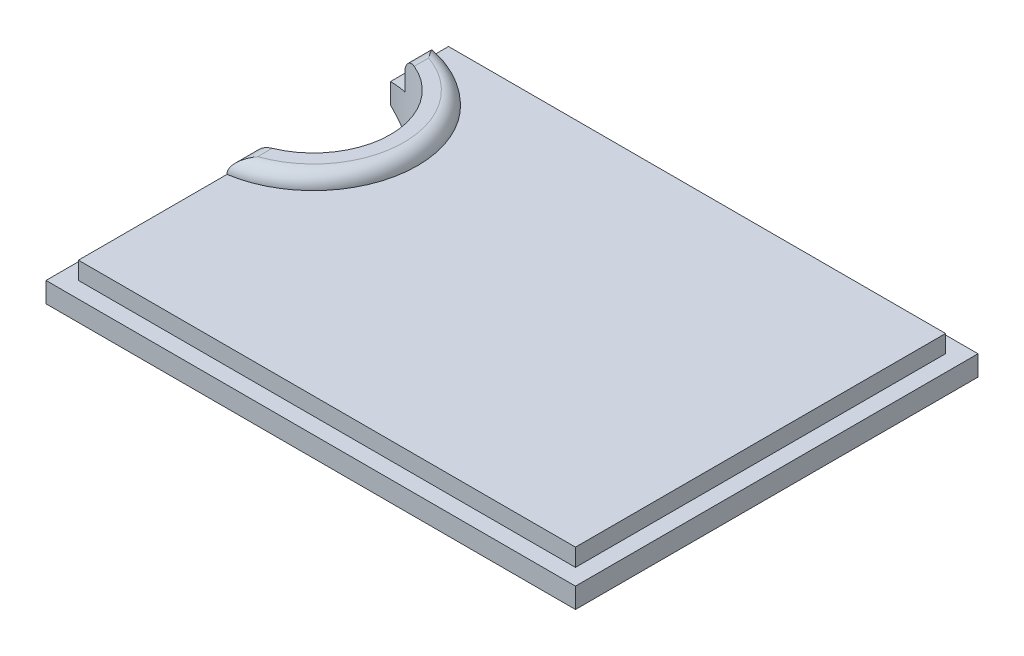
ISO-10303-21;
HEADER;
FILE_DESCRIPTION(('STEP AP214'),'2;1');
FILE_NAME('part.step','',(''),(''),'','','');
FILE_SCHEMA(('AUTOMOTIVE_DESIGN { 1 0 10303 214 1 1 1 1 }'));
ENDSEC;
DATA;
#1=APPLICATION_CONTEXT('core data for automotive mechanical design processes');
#2=APPLICATION_PROTOCOL_DEFINITION('international standard','automotive_design',2000,#1);
#3=PRODUCT_CONTEXT('',#1,'mechanical');
#4=PRODUCT('Part','Part','',(#3));
#5=PRODUCT_RELATED_PRODUCT_CATEGORY('part','',(#4));
#6=PRODUCT_DEFINITION_FORMATION('','',#4);
#7=PRODUCT_DEFINITION_CONTEXT('part definition',#1,'design');
#8=PRODUCT_DEFINITION('design','',#6,#7);
#9=PRODUCT_DEFINITION_SHAPE('','',#8);
#10=(LENGTH_UNIT() NAMED_UNIT(*) SI_UNIT(.MILLI.,.METRE.));
#11=(NAMED_UNIT(*) PLANE_ANGLE_UNIT() SI_UNIT($,.RADIAN.));
#12=(NAMED_UNIT(*) SI_UNIT($,.STERADIAN.) SOLID_ANGLE_UNIT());
#13=UNCERTAINTY_MEASURE_WITH_UNIT(LENGTH_MEASURE(1.E-05),#10,'distance_accuracy_value','');
#14=(GEOMETRIC_REPRESENTATION_CONTEXT(3) GLOBAL_UNCERTAINTY_ASSIGNED_CONTEXT((#13)) GLOBAL_UNIT_ASSIGNED_CONTEXT((#10,
#11,#12)) REPRESENTATION_CONTEXT('',''));
#15=CARTESIAN_POINT('',(0.,0.,0.));
#16=DIRECTION('',(0.,0.,1.));
#17=DIRECTION('',(1.,0.,0.));
#18=AXIS2_PLACEMENT_3D('',#15,#16,#17);
#19=CARTESIAN_POINT('',(-19.6,2.6,-4.9));
#20=DIRECTION('',(0.,1.,0.));
#21=DIRECTION('',(0.,0.,1.));
#22=AXIS2_PLACEMENT_3D('',#19,#20,#21);
#23=PLANE('',#22);
#24=DIRECTION('',(-1.,0.,0.));
#25=VECTOR('',#24,1.);
#26=CARTESIAN_POINT('',(-19.6,2.6,13.7));
#27=LINE('',#26,#25);
#28=CARTESIAN_POINT('',(18.4,2.6,13.7));
#29=VERTEX_POINT('',#28);
#30=CARTESIAN_POINT('',(-18.4,2.6,13.7));
#31=VERTEX_POINT('',#30);
#32=EDGE_CURVE('E241',#29,#31,#27,.T.);
#33=ORIENTED_EDGE('',*,*,#32,.T.);
#34=DIRECTION('',(0.,0.,-1.));
#35=VECTOR('',#34,1.);
#36=CARTESIAN_POINT('',(-18.4,2.6,-4.9));
#37=LINE('',#36,#35);
#38=CARTESIAN_POINT('',(-18.4,2.6,0.672252686302017));
#39=VERTEX_POINT('',#38);
#40=EDGE_CURVE('E245',#31,#39,#37,.T.);
#41=ORIENTED_EDGE('',*,*,#40,.T.);
#42=CARTESIAN_POINT('',(-19.6,2.6,-4.9));
#43=DIRECTION('',(0.,1.,0.));
#44=DIRECTION('',(0.,0.,1.));
#45=AXIS2_PLACEMENT_3D('',#42,#43,#44);
#46=CIRCLE('',#45,5.7);
#47=CARTESIAN_POINT('',(-19.6,2.6,0.800000000000004));
#48=VERTEX_POINT('',#47);
#49=EDGE_CURVE('E285',#48,#39,#46,.T.);
#50=ORIENTED_EDGE('',*,*,#49,.F.);
#51=DIRECTION('',(0.,0.,-1.));
#52=VECTOR('',#51,1.);
#53=CARTESIAN_POINT('',(-19.6,2.6,0.));
#54=LINE('',#53,#52);
#55=CARTESIAN_POINT('',(-19.6,2.6,14.9));
#56=VERTEX_POINT('',#55);
#57=EDGE_CURVE('E280',#56,#48,#54,.T.);
#58=ORIENTED_EDGE('',*,*,#57,.F.);
#59=DIRECTION('',(-1.,0.,0.));
#60=VECTOR('',#59,1.);
#61=CARTESIAN_POINT('',(0.,2.6,14.9));
#62=LINE('',#61,#60);
#63=CARTESIAN_POINT('',(19.6,2.6,14.9));
#64=VERTEX_POINT('',#63);
#65=EDGE_CURVE('E276',#64,#56,#62,.T.);
#66=ORIENTED_EDGE('',*,*,#65,.F.);
#67=DIRECTION('',(0.,0.,1.));
#68=VECTOR('',#67,1.);
#69=CARTESIAN_POINT('',(19.6,2.6,0.));
#70=LINE('',#69,#68);
#71=CARTESIAN_POINT('',(19.6,2.6,-14.9));
#72=VERTEX_POINT('',#71);
#73=EDGE_CURVE('E272',#72,#64,#70,.T.);
#74=ORIENTED_EDGE('',*,*,#73,.F.);
#75=DIRECTION('',(1.,0.,0.));
#76=VECTOR('',#75,1.);
#77=CARTESIAN_POINT('',(0.,2.6,-14.9));
#78=LINE('',#77,#76);
#79=CARTESIAN_POINT('',(-19.6,2.6,-14.9));
#80=VERTEX_POINT('',#79);
#81=EDGE_CURVE('E255',#80,#72,#78,.T.);
#82=ORIENTED_EDGE('',*,*,#81,.F.);
#83=DIRECTION('',(0.,0.,-1.));
#84=VECTOR('',#83,1.);
#85=CARTESIAN_POINT('',(-19.6,2.6,0.));
#86=LINE('',#85,#84);
#87=CARTESIAN_POINT('',(-19.6,2.6,-10.6));
#88=VERTEX_POINT('',#87);
#89=EDGE_CURVE('E289',#88,#80,#86,.T.);
#90=ORIENTED_EDGE('',*,*,#89,.F.);
#91=CARTESIAN_POINT('',(-18.4,2.6,-10.472252686302));
#92=VERTEX_POINT('',#91);
#93=EDGE_CURVE('E284',#92,#88,#46,.T.);
#94=ORIENTED_EDGE('',*,*,#93,.F.);
#95=DIRECTION('',(0.,0.,-1.));
#96=VECTOR('',#95,1.);
#97=CARTESIAN_POINT('',(-18.4,2.6,-4.9));
#98=LINE('',#97,#96);
#99=CARTESIAN_POINT('',(-18.4,2.6,-13.7));
#100=VERTEX_POINT('',#99);
#101=EDGE_CURVE('E224',#92,#100,#98,.T.);
#102=ORIENTED_EDGE('',*,*,#101,.T.);
#103=DIRECTION('',(1.,0.,0.));
#104=VECTOR('',#103,1.);
#105=CARTESIAN_POINT('',(-19.6,2.6,-13.7));
#106=LINE('',#105,#104);
#107=CARTESIAN_POINT('',(18.4,2.6,-13.7));
#108=VERTEX_POINT('',#107);
#109=EDGE_CURVE('E218',#100,#108,#106,.T.);
#110=ORIENTED_EDGE('',*,*,#109,.T.);
#111=DIRECTION('',(0.,0.,1.));
#112=VECTOR('',#111,1.);
#113=CARTESIAN_POINT('',(18.4,2.6,-4.9));
#114=LINE('',#113,#112);
#115=EDGE_CURVE('E237',#108,#29,#114,.T.);
#116=ORIENTED_EDGE('',*,*,#115,.T.);
#117=EDGE_LOOP('',(#33,#41,#50,#58,#66,#74,#82,#90,#94,#102,#110,#116));
#118=FACE_BOUND('',#117,.T.);
#119=ADVANCED_FACE('F41',(#118),#23,.T.);
#120=CARTESIAN_POINT('',(-19.6,1.,0.));
#121=DIRECTION('',(1.,0.,0.));
#122=DIRECTION('',(0.,0.,-1.));
#123=AXIS2_PLACEMENT_3D('',#120,#121,#122);
#124=PLANE('',#123);
#125=DIRECTION('',(0.,-1.,0.));
#126=VECTOR('',#125,1.);
#127=CARTESIAN_POINT('',(-19.6,1.,-14.9));
#128=LINE('',#127,#126);
#129=CARTESIAN_POINT('',(-19.6,1.1,-14.9));
#130=VERTEX_POINT('',#129);
#131=EDGE_CURVE('E297',#80,#130,#128,.T.);
#132=ORIENTED_EDGE('',*,*,#131,.T.);
#133=DIRECTION('',(0.,0.,1.));
#134=VECTOR('',#133,1.);
#135=CARTESIAN_POINT('',(-19.6,1.1,0.));
#136=LINE('',#135,#134);
#137=CARTESIAN_POINT('',(-19.6,1.1,-10.6));
#138=VERTEX_POINT('',#137);
#139=EDGE_CURVE('E180',#130,#138,#136,.T.);
#140=ORIENTED_EDGE('',*,*,#139,.T.);
#141=DIRECTION('',(0.,-1.,0.));
#142=VECTOR('',#141,1.);
#143=CARTESIAN_POINT('',(-19.6,1.,-10.6));
#144=LINE('',#143,#142);
#145=EDGE_CURVE('E313',#88,#138,#144,.T.);
#146=ORIENTED_EDGE('',*,*,#145,.F.);
#147=ORIENTED_EDGE('',*,*,#89,.T.);
#148=EDGE_LOOP('',(#132,#140,#146,#147));
#149=FACE_BOUND('',#148,.T.);
#150=ADVANCED_FACE('F345',(#149),#124,.F.);
#151=CARTESIAN_POINT('',(-19.6,1.,-4.9));
#152=DIRECTION('',(0.,-1.,0.));
#153=DIRECTION('',(0.,0.,-1.));
#154=AXIS2_PLACEMENT_3D('',#151,#152,#153);
#155=CYLINDRICAL_SURFACE('',#154,5.7);
#156=ORIENTED_EDGE('',*,*,#145,.T.);
#157=CARTESIAN_POINT('',(-19.6,1.1,-4.9));
#158=DIRECTION('',(0.707106781186547,0.707106781186547,0.));
#159=DIRECTION('',(0.707106781186548,-0.707106781186548,0.));
#160=AXIS2_PLACEMENT_3D('',#157,#158,#159);
#161=ELLIPSE('',#160,8.06101730552664,5.7);
#162=CARTESIAN_POINT('',(-18.5,0.,-10.4928525816438));
#163=VERTEX_POINT('',#162);
#164=EDGE_CURVE('E373',#138,#163,#161,.F.);
#165=ORIENTED_EDGE('',*,*,#164,.T.);
#166=CARTESIAN_POINT('',(-19.6,0.,-4.9));
#167=DIRECTION('',(0.,1.,0.));
#168=DIRECTION('',(0.,0.,1.));
#169=AXIS2_PLACEMENT_3D('',#166,#167,#168);
#170=CIRCLE('',#169,5.7);
#171=CARTESIAN_POINT('',(-18.5,0.,0.692852581643828));
#172=VERTEX_POINT('',#171);
#173=EDGE_CURVE('E293',#163,#172,#170,.F.);
#174=ORIENTED_EDGE('',*,*,#173,.T.);
#175=CARTESIAN_POINT('',(-19.6,1.1,-4.9));
#176=DIRECTION('',(0.707106781186546,0.707106781186549,0.));
#177=DIRECTION('',(0.707106781186549,-0.707106781186546,0.));
#178=AXIS2_PLACEMENT_3D('',#175,#176,#177);
#179=ELLIPSE('',#178,8.06101730552663,5.7);
#180=CARTESIAN_POINT('',(-19.6,1.1,0.800000000000004));
#181=VERTEX_POINT('',#180);
#182=EDGE_CURVE('E370',#172,#181,#179,.F.);
#183=ORIENTED_EDGE('',*,*,#182,.T.);
#184=DIRECTION('',(0.,-1.,0.));
#185=VECTOR('',#184,1.);
#186=CARTESIAN_POINT('',(-19.6,1.,0.800000000000004));
#187=LINE('',#186,#185);
#188=EDGE_CURVE('E310',#48,#181,#187,.T.);
#189=ORIENTED_EDGE('',*,*,#188,.F.);
#190=ORIENTED_EDGE('',*,*,#49,.T.);
#191=DIRECTION('',(0.,-1.,0.));
#192=VECTOR('',#191,1.);
#193=CARTESIAN_POINT('',(-18.4,3.9,0.672252686302017));
#194=LINE('',#193,#192);
#195=CARTESIAN_POINT('',(-18.4,3.9,0.672252686302017));
#196=VERTEX_POINT('',#195);
#197=EDGE_CURVE('E258',#196,#39,#194,.T.);
#198=ORIENTED_EDGE('',*,*,#197,.F.);
#199=CARTESIAN_POINT('',(-18.4,3.9,0.672252686302017));
#200=CARTESIAN_POINT('',(-18.4000001079173,3.92755447480799,0.67225152705345));
#201=CARTESIAN_POINT('',(-18.3988603702911,3.95509571469284,0.672007396221028));
#202=CARTESIAN_POINT('',(-18.394315476748,4.00998015483608,0.671026189757371));
#203=CARTESIAN_POINT('',(-18.3909104520967,4.03732336647671,0.6702891426889));
#204=CARTESIAN_POINT('',(-18.3773360193078,4.11869934046993,0.667331867003854));
#205=CARTESIAN_POINT('',(-18.3638071273308,4.17218534315875,0.664365549563519));
#206=CARTESIAN_POINT('',(-18.3282200228443,4.27606867131247,0.656339112501708));
#207=CARTESIAN_POINT('',(-18.3061580448791,4.32646462181798,0.651278068456086));
#208=CARTESIAN_POINT('',(-18.2542319704272,4.42275979553489,0.63891846404062));
#209=CARTESIAN_POINT('',(-18.2243688158099,4.46865956067072,0.63162017376462));
#210=CARTESIAN_POINT('',(-18.1577141972349,4.55486542069649,0.614616463251694));
#211=CARTESIAN_POINT('',(-18.1208989938913,4.59515150208675,0.604902757910106));
#212=CARTESIAN_POINT('',(-18.0416338062878,4.6689196602704,0.582990261684476));
#213=CARTESIAN_POINT('',(-17.9991837929777,4.70240170198311,0.570791457988263));
#214=CARTESIAN_POINT('',(-17.9092236143074,4.76236073237163,0.543667702729391));
#215=CARTESIAN_POINT('',(-17.8616364732349,4.78870160169155,0.52869786148032));
#216=CARTESIAN_POINT('',(-17.7635192084501,4.83314309642285,0.496295815589277));
#217=CARTESIAN_POINT('',(-17.7129876175598,4.85123957347438,0.478862377097759));
#218=CARTESIAN_POINT('',(-17.6185796867025,4.8768439144047,0.444723985570395));
#219=CARTESIAN_POINT('',(-17.5749112773839,4.8855719653171,0.428338107830527));
#220=CARTESIAN_POINT('',(-17.4874121733881,4.89714999994655,0.39426197972992));
#221=CARTESIAN_POINT('',(-17.443582037192,4.90001270944679,0.376574639720349));
#222=CARTESIAN_POINT('',(-17.4,4.9,0.358326730053966));
#223=B_SPLINE_CURVE_WITH_KNOTS('',3,(#199,#200,#201,#202,#203,#204,#205,#206,#207,#208,#209,
#210,#211,#212,#213,#214,#215,#216,#217,#218,#219,#220,#221,#222),.UNSPECIFIED.,.F.,.F.,(4,2,2,
2,2,2,2,2,2,2,2,4),(0.,0.0826125062778862,0.165220225866091,0.330119056481052,0.495090736350048,
0.660042507682452,0.825568078601229,0.991094502925172,1.15958386891928,1.32815792091746,
1.47013370553256,1.61180112368928),.UNSPECIFIED.);
#224=CARTESIAN_POINT('',(-17.4,4.9,0.358326730053966));
#225=VERTEX_POINT('',#224);
#226=EDGE_CURVE('E330',#196,#225,#223,.T.);
#227=ORIENTED_EDGE('',*,*,#226,.T.);
#228=CARTESIAN_POINT('',(-19.6,4.9,-4.9));
#229=DIRECTION('',(0.,1.,0.));
#230=DIRECTION('',(0.,0.,1.));
#231=AXIS2_PLACEMENT_3D('',#228,#229,#230);
#232=CIRCLE('',#231,5.7);
#233=CARTESIAN_POINT('',(-17.4,4.9,-10.158326730054));
#234=VERTEX_POINT('',#233);
#235=EDGE_CURVE('E212',#225,#234,#232,.T.);
#236=ORIENTED_EDGE('',*,*,#235,.T.);
#237=CARTESIAN_POINT('',(-17.4,4.9,-10.158326730054));
#238=CARTESIAN_POINT('',(-17.4282007981995,4.89999884993499,-10.1701267489231));
#239=CARTESIAN_POINT('',(-17.4564874143663,4.89880613169031,-10.1816932076955));
#240=CARTESIAN_POINT('',(-17.5130725370845,4.89399326215805,-10.2043058946483));
#241=CARTESIAN_POINT('',(-17.541371044402,4.89037228346583,-10.2153519441313));
#242=CARTESIAN_POINT('',(-17.6260719067233,4.87579197116022,-10.247639361786));
#243=CARTESIAN_POINT('',(-17.6822226221694,4.86111508334928,-10.2680062113431));
#244=CARTESIAN_POINT('',(-17.7920650544846,4.8217912242615,-10.3059934054945));
#245=CARTESIAN_POINT('',(-17.8457503885107,4.79711983745522,-10.3236068767783));
#246=CARTESIAN_POINT('',(-17.9485371984653,4.73821650337357,-10.3557829499127));
#247=CARTESIAN_POINT('',(-17.9976445948284,4.70399713947316,-10.3703495233897));
#248=CARTESIAN_POINT('',(-18.0869605725761,4.62890843976739,-10.3957035794858));
#249=CARTESIAN_POINT('',(-18.1275040263225,4.58849096962409,-10.4066511507273));
#250=CARTESIAN_POINT('',(-18.2013538516934,4.50092501746397,-10.4258709053498));
#251=CARTESIAN_POINT('',(-18.2346582388836,4.45377469563515,-10.4341423554324));
#252=CARTESIAN_POINT('',(-18.2916663677524,4.35608070815813,-10.4478908923066));
#253=CARTESIAN_POINT('',(-18.315688022818,4.30573524178132,-10.4534625825945));
#254=CARTESIAN_POINT('',(-18.3550538650618,4.20160117018706,-10.4624203510874));
#255=CARTESIAN_POINT('',(-18.3704060659351,4.14781579605931,-10.4658084481289));
#256=CARTESIAN_POINT('',(-18.3874336510522,4.06133326203827,-10.4695351619353));
#257=CARTESIAN_POINT('',(-18.3921439827854,4.02923131823743,-10.4705565920966));
#258=CARTESIAN_POINT('',(-18.398425834895,3.96475786337315,-10.4719137900473));
#259=CARTESIAN_POINT('',(-18.4000022232439,3.93238684893401,-10.4722506212467));
#260=CARTESIAN_POINT('',(-18.4,3.9,-10.472252686302));
#261=B_SPLINE_CURVE_WITH_KNOTS('',3,(#237,#238,#239,#240,#241,#242,#243,#244,#245,#246,#247,
#248,#249,#250,#251,#252,#253,#254,#255,#256,#257,#258,#259,#260),.UNSPECIFIED.,.F.,.F.,(4,2,2,
2,2,2,2,2,2,2,2,4),(0.,0.0916616433016817,0.183354535240855,0.366923321540028,0.55094327797502,
0.734721848946884,0.908701297585988,1.08272837896845,1.25011335115848,1.41734334507095,
1.51458379693829,1.61167308626351),.UNSPECIFIED.);
#262=CARTESIAN_POINT('',(-18.4,3.9,-10.472252686302));
#263=VERTEX_POINT('',#262);
#264=EDGE_CURVE('E321',#234,#263,#261,.T.);
#265=ORIENTED_EDGE('',*,*,#264,.T.);
#266=DIRECTION('',(0.,-1.,0.));
#267=VECTOR('',#266,1.);
#268=CARTESIAN_POINT('',(-18.4,3.9,-10.472252686302));
#269=LINE('',#268,#267);
#270=EDGE_CURVE('E175',#263,#92,#269,.T.);
#271=ORIENTED_EDGE('',*,*,#270,.T.);
#272=ORIENTED_EDGE('',*,*,#93,.T.);
#273=EDGE_LOOP('',(#156,#165,#174,#183,#189,#190,#198,#227,#236,#265,#271,#272));
#274=FACE_BOUND('',#273,.T.);
#275=ADVANCED_FACE('F340',(#274),#155,.F.);
#276=ORIENTED_EDGE('',*,*,#188,.T.);
#277=DIRECTION('',(0.,0.,1.));
#278=VECTOR('',#277,1.);
#279=CARTESIAN_POINT('',(-19.6,1.1,0.));
#280=LINE('',#279,#278);
#281=CARTESIAN_POINT('',(-19.6,1.1,14.9));
#282=VERTEX_POINT('',#281);
#283=EDGE_CURVE('E11',#181,#282,#280,.T.);
#284=ORIENTED_EDGE('',*,*,#283,.T.);
#285=DIRECTION('',(0.,-1.,0.));
#286=VECTOR('',#285,1.);
#287=CARTESIAN_POINT('',(-19.6,1.,14.9));
#288=LINE('',#287,#286);
#289=EDGE_CURVE('E307',#56,#282,#288,.T.);
#290=ORIENTED_EDGE('',*,*,#289,.F.);
#291=ORIENTED_EDGE('',*,*,#57,.T.);
#292=EDGE_LOOP('',(#276,#284,#290,#291));
#293=FACE_BOUND('',#292,.T.);
#294=ADVANCED_FACE('F344',(#293),#124,.F.);
#295=CARTESIAN_POINT('',(0.,1.,14.9));
#296=DIRECTION('',(0.,0.,-1.));
#297=DIRECTION('',(-1.,0.,0.));
#298=AXIS2_PLACEMENT_3D('',#295,#296,#297);
#299=PLANE('',#298);
#300=ORIENTED_EDGE('',*,*,#289,.T.);
#301=DIRECTION('',(1.,0.,0.));
#302=VECTOR('',#301,1.);
#303=CARTESIAN_POINT('',(0.,1.1,14.9));
#304=LINE('',#303,#302);
#305=CARTESIAN_POINT('',(19.6,1.1,14.9));
#306=VERTEX_POINT('',#305);
#307=EDGE_CURVE('E52',#282,#306,#304,.T.);
#308=ORIENTED_EDGE('',*,*,#307,.T.);
#309=DIRECTION('',(0.,-1.,0.));
#310=VECTOR('',#309,1.);
#311=CARTESIAN_POINT('',(19.6,1.,14.9));
#312=LINE('',#311,#310);
#313=EDGE_CURVE('E304',#64,#306,#312,.T.);
#314=ORIENTED_EDGE('',*,*,#313,.F.);
#315=ORIENTED_EDGE('',*,*,#65,.T.);
#316=EDGE_LOOP('',(#300,#308,#314,#315));
#317=FACE_BOUND('',#316,.T.);
#318=ADVANCED_FACE('F450',(#317),#299,.F.);
#319=CARTESIAN_POINT('',(19.6,1.,0.));
#320=DIRECTION('',(-1.,0.,0.));
#321=DIRECTION('',(0.,0.,1.));
#322=AXIS2_PLACEMENT_3D('',#319,#320,#321);
#323=PLANE('',#322);
#324=ORIENTED_EDGE('',*,*,#313,.T.);
#325=DIRECTION('',(0.,0.,-1.));
#326=VECTOR('',#325,1.);
#327=CARTESIAN_POINT('',(19.6,1.1,0.));
#328=LINE('',#327,#326);
#329=CARTESIAN_POINT('',(19.6,1.1,-14.9));
#330=VERTEX_POINT('',#329);
#331=EDGE_CURVE('E394',#306,#330,#328,.T.);
#332=ORIENTED_EDGE('',*,*,#331,.T.);
#333=DIRECTION('',(0.,-1.,0.));
#334=VECTOR('',#333,1.);
#335=CARTESIAN_POINT('',(19.6,1.,-14.9));
#336=LINE('',#335,#334);
#337=EDGE_CURVE('E301',#72,#330,#336,.T.);
#338=ORIENTED_EDGE('',*,*,#337,.F.);
#339=ORIENTED_EDGE('',*,*,#73,.T.);
#340=EDGE_LOOP('',(#324,#332,#338,#339));
#341=FACE_BOUND('',#340,.T.);
#342=ADVANCED_FACE('F442',(#341),#323,.F.);
#343=CARTESIAN_POINT('',(0.,1.,-14.9));
#344=DIRECTION('',(0.,0.,1.));
#345=DIRECTION('',(1.,0.,0.));
#346=AXIS2_PLACEMENT_3D('',#343,#344,#345);
#347=PLANE('',#346);
#348=ORIENTED_EDGE('',*,*,#337,.T.);
#349=DIRECTION('',(-1.,0.,0.));
#350=VECTOR('',#349,1.);
#351=CARTESIAN_POINT('',(0.,1.1,-14.9));
#352=LINE('',#351,#350);
#353=EDGE_CURVE('E391',#330,#130,#352,.T.);
#354=ORIENTED_EDGE('',*,*,#353,.T.);
#355=ORIENTED_EDGE('',*,*,#131,.F.);
#356=ORIENTED_EDGE('',*,*,#81,.T.);
#357=EDGE_LOOP('',(#348,#354,#355,#356));
#358=FACE_BOUND('',#357,.T.);
#359=ADVANCED_FACE('F444',(#358),#347,.F.);
#360=CARTESIAN_POINT('',(0.,0.,0.));
#361=DIRECTION('',(0.,1.,0.));
#362=DIRECTION('',(0.,0.,1.));
#363=AXIS2_PLACEMENT_3D('',#360,#361,#362);
#364=PLANE('',#363);
#365=ORIENTED_EDGE('',*,*,#173,.F.);
#366=DIRECTION('',(0.,0.,-1.));
#367=VECTOR('',#366,1.);
#368=CARTESIAN_POINT('',(-18.5,0.,0.));
#369=LINE('',#368,#367);
#370=CARTESIAN_POINT('',(-18.5,0.,-13.8));
#371=VERTEX_POINT('',#370);
#372=EDGE_CURVE('E388',#163,#371,#369,.T.);
#373=ORIENTED_EDGE('',*,*,#372,.T.);
#374=DIRECTION('',(1.,0.,0.));
#375=VECTOR('',#374,1.);
#376=CARTESIAN_POINT('',(0.,0.,-13.8));
#377=LINE('',#376,#375);
#378=CARTESIAN_POINT('',(18.5,0.,-13.8));
#379=VERTEX_POINT('',#378);
#380=EDGE_CURVE('E385',#371,#379,#377,.T.);
#381=ORIENTED_EDGE('',*,*,#380,.T.);
#382=DIRECTION('',(0.,0.,1.));
#383=VECTOR('',#382,1.);
#384=CARTESIAN_POINT('',(18.5,0.,0.));
#385=LINE('',#384,#383);
#386=CARTESIAN_POINT('',(18.5,0.,13.8));
#387=VERTEX_POINT('',#386);
#388=EDGE_CURVE('E382',#379,#387,#385,.T.);
#389=ORIENTED_EDGE('',*,*,#388,.T.);
#390=DIRECTION('',(-1.,0.,0.));
#391=VECTOR('',#390,1.);
#392=CARTESIAN_POINT('',(0.,0.,13.8));
#393=LINE('',#392,#391);
#394=CARTESIAN_POINT('',(-18.5,0.,13.8));
#395=VERTEX_POINT('',#394);
#396=EDGE_CURVE('E379',#387,#395,#393,.T.);
#397=ORIENTED_EDGE('',*,*,#396,.T.);
#398=DIRECTION('',(0.,0.,-1.));
#399=VECTOR('',#398,1.);
#400=CARTESIAN_POINT('',(-18.5,0.,0.));
#401=LINE('',#400,#399);
#402=EDGE_CURVE('E376',#395,#172,#401,.T.);
#403=ORIENTED_EDGE('',*,*,#402,.T.);
#404=EDGE_LOOP('',(#365,#373,#381,#389,#397,#403));
#405=FACE_BOUND('',#404,.T.);
#406=ADVANCED_FACE('F424',(#405),#364,.F.);
#407=CARTESIAN_POINT('',(-19.6,3.9,-13.7));
#408=DIRECTION('',(0.,0.,-1.));
#409=DIRECTION('',(-1.,0.,0.));
#410=AXIS2_PLACEMENT_3D('',#407,#408,#409);
#411=PLANE('',#410);
#412=ORIENTED_EDGE('',*,*,#109,.F.);
#413=DIRECTION('',(0.,-1.,0.));
#414=VECTOR('',#413,1.);
#415=CARTESIAN_POINT('',(-18.4,3.9,-13.7));
#416=LINE('',#415,#414);
#417=CARTESIAN_POINT('',(-18.4,3.9,-13.7));
#418=VERTEX_POINT('',#417);
#419=EDGE_CURVE('E252',#418,#100,#416,.T.);
#420=ORIENTED_EDGE('',*,*,#419,.F.);
#421=DIRECTION('',(1.,0.,0.));
#422=VECTOR('',#421,1.);
#423=CARTESIAN_POINT('',(-19.6,3.9,-13.7));
#424=LINE('',#423,#422);
#425=CARTESIAN_POINT('',(18.4,3.9,-13.7));
#426=VERTEX_POINT('',#425);
#427=EDGE_CURVE('E192',#418,#426,#424,.T.);
#428=ORIENTED_EDGE('',*,*,#427,.T.);
#429=DIRECTION('',(0.,-1.,0.));
#430=VECTOR('',#429,1.);
#431=CARTESIAN_POINT('',(18.4,3.9,-13.7));
#432=LINE('',#431,#430);
#433=EDGE_CURVE('E194',#426,#108,#432,.T.);
#434=ORIENTED_EDGE('',*,*,#433,.T.);
#435=EDGE_LOOP('',(#412,#420,#428,#434));
#436=FACE_BOUND('',#435,.T.);
#437=ADVANCED_FACE('F467',(#436),#411,.T.);
#438=CARTESIAN_POINT('',(-18.4,3.9,-4.9));
#439=DIRECTION('',(-1.,0.,0.));
#440=DIRECTION('',(0.,0.,1.));
#441=AXIS2_PLACEMENT_3D('',#438,#439,#440);
#442=PLANE('',#441);
#443=ORIENTED_EDGE('',*,*,#270,.F.);
#444=DIRECTION('',(0.,0.,-1.));
#445=VECTOR('',#444,1.);
#446=CARTESIAN_POINT('',(-18.4,3.9,-4.9));
#447=LINE('',#446,#445);
#448=CARTESIAN_POINT('',(-18.4,3.9,-12.5059187479226));
#449=VERTEX_POINT('',#448);
#450=EDGE_CURVE('E168',#263,#449,#447,.T.);
#451=ORIENTED_EDGE('',*,*,#450,.T.);
#452=DIRECTION('',(0.,0.,-1.));
#453=VECTOR('',#452,1.);
#454=CARTESIAN_POINT('',(-18.4,3.9,-4.9));
#455=LINE('',#454,#453);
#456=EDGE_CURVE('E172',#449,#418,#455,.T.);
#457=ORIENTED_EDGE('',*,*,#456,.T.);
#458=ORIENTED_EDGE('',*,*,#419,.T.);
#459=ORIENTED_EDGE('',*,*,#101,.F.);
#460=EDGE_LOOP('',(#443,#451,#457,#458,#459));
#461=FACE_BOUND('',#460,.T.);
#462=ADVANCED_FACE('F170',(#461),#442,.T.);
#463=CARTESIAN_POINT('',(-18.4,3.9,-4.9));
#464=DIRECTION('',(-1.,0.,0.));
#465=DIRECTION('',(0.,0.,1.));
#466=AXIS2_PLACEMENT_3D('',#463,#464,#465);
#467=PLANE('',#466);
#468=DIRECTION('',(0.,0.,-1.));
#469=VECTOR('',#468,1.);
#470=CARTESIAN_POINT('',(-18.4,3.9,-4.9));
#471=LINE('',#470,#469);
#472=CARTESIAN_POINT('',(-18.4,3.9,13.7));
#473=VERTEX_POINT('',#472);
#474=CARTESIAN_POINT('',(-18.4,3.9,2.70591874792257));
#475=VERTEX_POINT('',#474);
#476=EDGE_CURVE('E195',#473,#475,#471,.T.);
#477=ORIENTED_EDGE('',*,*,#476,.T.);
#478=DIRECTION('',(0.,0.,-1.));
#479=VECTOR('',#478,1.);
#480=CARTESIAN_POINT('',(-18.4,3.9,-4.9));
#481=LINE('',#480,#479);
#482=EDGE_CURVE('E317',#475,#196,#481,.T.);
#483=ORIENTED_EDGE('',*,*,#482,.T.);
#484=ORIENTED_EDGE('',*,*,#197,.T.);
#485=ORIENTED_EDGE('',*,*,#40,.F.);
#486=DIRECTION('',(0.,-1.,0.));
#487=VECTOR('',#486,1.);
#488=CARTESIAN_POINT('',(-18.4,3.9,13.7));
#489=LINE('',#488,#487);
#490=EDGE_CURVE('E261',#473,#31,#489,.T.);
#491=ORIENTED_EDGE('',*,*,#490,.F.);
#492=EDGE_LOOP('',(#477,#483,#484,#485,#491));
#493=FACE_BOUND('',#492,.T.);
#494=ADVANCED_FACE('F455',(#493),#467,.T.);
#495=CARTESIAN_POINT('',(-19.6,3.9,13.7));
#496=DIRECTION('',(0.,0.,1.));
#497=DIRECTION('',(1.,0.,0.));
#498=AXIS2_PLACEMENT_3D('',#495,#496,#497);
#499=PLANE('',#498);
#500=ORIENTED_EDGE('',*,*,#32,.F.);
#501=DIRECTION('',(0.,-1.,0.));
#502=VECTOR('',#501,1.);
#503=CARTESIAN_POINT('',(18.4,3.9,13.7));
#504=LINE('',#503,#502);
#505=CARTESIAN_POINT('',(18.4,3.9,13.7));
#506=VERTEX_POINT('',#505);
#507=EDGE_CURVE('E264',#506,#29,#504,.T.);
#508=ORIENTED_EDGE('',*,*,#507,.F.);
#509=DIRECTION('',(-1.,0.,0.));
#510=VECTOR('',#509,1.);
#511=CARTESIAN_POINT('',(-19.6,3.9,13.7));
#512=LINE('',#511,#510);
#513=EDGE_CURVE('E228',#506,#473,#512,.T.);
#514=ORIENTED_EDGE('',*,*,#513,.T.);
#515=ORIENTED_EDGE('',*,*,#490,.T.);
#516=EDGE_LOOP('',(#500,#508,#514,#515));
#517=FACE_BOUND('',#516,.T.);
#518=ADVANCED_FACE('F473',(#517),#499,.T.);
#519=CARTESIAN_POINT('',(18.4,3.9,-4.9));
#520=DIRECTION('',(1.,0.,0.));
#521=DIRECTION('',(0.,0.,-1.));
#522=AXIS2_PLACEMENT_3D('',#519,#520,#521);
#523=PLANE('',#522);
#524=ORIENTED_EDGE('',*,*,#115,.F.);
#525=ORIENTED_EDGE('',*,*,#433,.F.);
#526=DIRECTION('',(0.,0.,1.));
#527=VECTOR('',#526,1.);
#528=CARTESIAN_POINT('',(18.4,3.9,-4.9));
#529=LINE('',#528,#527);
#530=EDGE_CURVE('E223',#426,#506,#529,.T.);
#531=ORIENTED_EDGE('',*,*,#530,.T.);
#532=ORIENTED_EDGE('',*,*,#507,.T.);
#533=EDGE_LOOP('',(#524,#525,#531,#532));
#534=FACE_BOUND('',#533,.T.);
#535=ADVANCED_FACE('F470',(#534),#523,.T.);
#536=CARTESIAN_POINT('',(-19.6,3.9,-4.9));
#537=DIRECTION('',(0.,1.,0.));
#538=DIRECTION('',(0.,0.,1.));
#539=AXIS2_PLACEMENT_3D('',#536,#537,#538);
#540=PLANE('',#539);
#541=CARTESIAN_POINT('',(-19.6,3.9,-4.9));
#542=DIRECTION('',(0.,1.,0.));
#543=DIRECTION('',(0.,0.,1.));
#544=AXIS2_PLACEMENT_3D('',#541,#542,#543);
#545=CIRCLE('',#544,7.7);
#546=EDGE_CURVE('E188',#475,#449,#545,.T.);
#547=ORIENTED_EDGE('',*,*,#546,.F.);
#548=ORIENTED_EDGE('',*,*,#476,.F.);
#549=ORIENTED_EDGE('',*,*,#513,.F.);
#550=ORIENTED_EDGE('',*,*,#530,.F.);
#551=ORIENTED_EDGE('',*,*,#427,.F.);
#552=ORIENTED_EDGE('',*,*,#456,.F.);
#553=EDGE_LOOP('',(#547,#548,#549,#550,#551,#552));
#554=FACE_BOUND('',#553,.T.);
#555=ADVANCED_FACE('F185',(#554),#540,.T.);
#556=CARTESIAN_POINT('',(-19.6,4.9,-4.9));
#557=DIRECTION('',(0.,1.,0.));
#558=DIRECTION('',(0.,0.,1.));
#559=AXIS2_PLACEMENT_3D('',#556,#557,#558);
#560=PLANE('',#559);
#561=ORIENTED_EDGE('',*,*,#235,.F.);
#562=DIRECTION('',(0.,0.,-1.));
#563=VECTOR('',#562,1.);
#564=CARTESIAN_POINT('',(-17.4,4.9,-4.9));
#565=LINE('',#564,#563);
#566=CARTESIAN_POINT('',(-17.4,4.9,1.4285069329187));
#567=VERTEX_POINT('',#566);
#568=EDGE_CURVE('E181',#225,#567,#565,.F.);
#569=ORIENTED_EDGE('',*,*,#568,.T.);
#570=CARTESIAN_POINT('',(-19.6,4.9,-4.9));
#571=DIRECTION('',(0.,1.,0.));
#572=DIRECTION('',(0.,0.,1.));
#573=AXIS2_PLACEMENT_3D('',#570,#571,#572);
#574=CIRCLE('',#573,6.7);
#575=CARTESIAN_POINT('',(-17.4,4.9,-11.2285069329187));
#576=VERTEX_POINT('',#575);
#577=EDGE_CURVE('E459',#567,#576,#574,.T.);
#578=ORIENTED_EDGE('',*,*,#577,.T.);
#579=DIRECTION('',(0.,0.,-1.));
#580=VECTOR('',#579,1.);
#581=CARTESIAN_POINT('',(-17.4,4.9,-4.9));
#582=LINE('',#581,#580);
#583=EDGE_CURVE('E201',#576,#234,#582,.F.);
#584=ORIENTED_EDGE('',*,*,#583,.T.);
#585=EDGE_LOOP('',(#561,#569,#578,#584));
#586=FACE_BOUND('',#585,.T.);
#587=ADVANCED_FACE('F461',(#586),#560,.T.);
#588=CARTESIAN_POINT('',(-17.4,3.9,-4.9));
#589=DIRECTION('',(0.,0.,-1.));
#590=DIRECTION('',(-1.,0.,0.));
#591=AXIS2_PLACEMENT_3D('',#588,#589,#590);
#592=CYLINDRICAL_SURFACE('',#591,1.);
#593=ORIENTED_EDGE('',*,*,#264,.F.);
#594=ORIENTED_EDGE('',*,*,#583,.F.);
#595=CARTESIAN_POINT('',(-18.4,3.9,-12.5059187479226));
#596=CARTESIAN_POINT('',(-18.4000033632425,3.92125630080382,-12.5059222681319));
#597=CARTESIAN_POINT('',(-18.3993216169089,3.94249855239257,-12.5051249769939));
#598=CARTESIAN_POINT('',(-18.3966254588549,3.98476209785892,-12.501969285249));
#599=CARTESIAN_POINT('',(-18.394612293732,4.00578357975595,-12.4996123449289));
#600=CARTESIAN_POINT('',(-18.3866868421284,4.06784229303523,-12.4903270893318));
#601=CARTESIAN_POINT('',(-18.3788867996147,4.10833527854564,-12.4811823697108));
#602=CARTESIAN_POINT('',(-18.3589468800857,4.18643800486249,-12.4577369781254));
#603=CARTESIAN_POINT('',(-18.3468215781174,4.22405691980965,-12.4434536207243));
#604=CARTESIAN_POINT('',(-18.31904012146,4.29605427531835,-12.4106048523264));
#605=CARTESIAN_POINT('',(-18.303374814606,4.33042398290879,-12.3920283391261));
#606=CARTESIAN_POINT('',(-18.2614793710534,4.41062754241086,-12.342123498999));
#607=CARTESIAN_POINT('',(-18.2337068933399,4.45444813917018,-12.3088631752211));
#608=CARTESIAN_POINT('',(-18.1743760774368,4.53469827486435,-12.2372466112683));
#609=CARTESIAN_POINT('',(-18.1428101838484,4.57111266120757,-12.1988801843127));
#610=CARTESIAN_POINT('',(-18.0602788290146,4.65434541739157,-12.0976844469237));
#611=CARTESIAN_POINT('',(-18.0077557266149,4.69673821977854,-12.032502645123));
#612=CARTESIAN_POINT('',(-17.9002921134244,4.76826328066321,-11.8971294536491));
#613=CARTESIAN_POINT('',(-17.8453469102225,4.79736843633093,-11.8269281598601));
#614=CARTESIAN_POINT('',(-17.7254797304995,4.84814736184258,-11.6713042736685));
#615=CARTESIAN_POINT('',(-17.6604363601519,4.86774323948307,-11.5853097436225));
#616=CARTESIAN_POINT('',(-17.5312058792375,4.89353603333706,-11.4109951853621));
#617=CARTESIAN_POINT('',(-17.4670175434033,4.89975478702976,-11.3226791858113));
#618=CARTESIAN_POINT('',(-17.4025144066169,4.89999762041273,-11.2320422932946));
#619=CARTESIAN_POINT('',(-17.4012570146022,4.89999999016779,-11.2302747199075));
#620=CARTESIAN_POINT('',(-17.4,4.9,-11.2285069329187));
#621=B_SPLINE_CURVE_WITH_KNOTS('',3,(#595,#596,#597,#598,#599,#600,#601,#602,#603,#604,#605,
#606,#607,#608,#609,#610,#611,#612,#613,#614,#615,#616,#617,#618,#619,#620),.UNSPECIFIED.,.F.,
.F.,(4,2,2,2,2,2,2,2,2,2,2,2,4),(0.,0.0637166643275419,0.127373755518375,0.253326486177808,
0.378858735880994,0.504719321222337,0.688563911757855,0.872780933519458,1.15271825961289,
1.43322405081873,1.76098437456944,2.08820923881486,2.09471678164247),.UNSPECIFIED.);
#622=EDGE_CURVE('E199',#449,#576,#621,.T.);
#623=ORIENTED_EDGE('',*,*,#622,.F.);
#624=ORIENTED_EDGE('',*,*,#450,.F.);
#625=EDGE_LOOP('',(#593,#594,#623,#624));
#626=FACE_BOUND('',#625,.T.);
#627=ADVANCED_FACE('F200',(#626),#592,.T.);
#628=CARTESIAN_POINT('',(-19.6,3.9,-4.9));
#629=DIRECTION('',(0.,1.,0.));
#630=DIRECTION('',(0.,0.,1.));
#631=AXIS2_PLACEMENT_3D('',#628,#629,#630);
#632=TOROIDAL_SURFACE('',#631,6.7,1.);
#633=ORIENTED_EDGE('',*,*,#622,.T.);
#634=ORIENTED_EDGE('',*,*,#577,.F.);
#635=CARTESIAN_POINT('',(-18.4,3.9,2.70591874792257));
#636=CARTESIAN_POINT('',(-18.4000033632424,3.92125630080382,2.70592226813195));
#637=CARTESIAN_POINT('',(-18.3993216169089,3.94249855239257,2.70512497699387));
#638=CARTESIAN_POINT('',(-18.3966254588549,3.98476209785892,2.70196928524903));
#639=CARTESIAN_POINT('',(-18.394612293732,4.00578357975595,2.69961234492895));
#640=CARTESIAN_POINT('',(-18.3866868421284,4.06784229303523,2.69032708933185));
#641=CARTESIAN_POINT('',(-18.3788867996147,4.10833527854564,2.68118236971084));
#642=CARTESIAN_POINT('',(-18.3589468800857,4.18643800486249,2.65773697812542));
#643=CARTESIAN_POINT('',(-18.3468215781174,4.22405691980964,2.64345362072436));
#644=CARTESIAN_POINT('',(-18.31904012146,4.29605427531835,2.61060485232642));
#645=CARTESIAN_POINT('',(-18.303374814606,4.33042398290879,2.59202833912613));
#646=CARTESIAN_POINT('',(-18.2614793710534,4.41062754241086,2.54212349899899));
#647=CARTESIAN_POINT('',(-18.2337068933399,4.45444813917018,2.50886317522115));
#648=CARTESIAN_POINT('',(-18.1743760774368,4.53469827486435,2.43724661126832));
#649=CARTESIAN_POINT('',(-18.1428101838484,4.57111266120757,2.39888018431269));
#650=CARTESIAN_POINT('',(-18.0602788290146,4.65434541739157,2.2976844469237));
#651=CARTESIAN_POINT('',(-18.0077557266149,4.69673821977853,2.232502645123));
#652=CARTESIAN_POINT('',(-17.9002921134244,4.76826328066321,2.09712945364912));
#653=CARTESIAN_POINT('',(-17.8453469102225,4.79736843633093,2.0269281598601));
#654=CARTESIAN_POINT('',(-17.7254797304995,4.84814736184257,1.87130427366848));
#655=CARTESIAN_POINT('',(-17.6604363601519,4.86774323948307,1.78530974362248));
#656=CARTESIAN_POINT('',(-17.5312058792375,4.89353603333706,1.61099518536212));
#657=CARTESIAN_POINT('',(-17.4670175434033,4.89975478702976,1.52267918581126));
#658=CARTESIAN_POINT('',(-17.4025144066169,4.89999762041273,1.43204229329458));
#659=CARTESIAN_POINT('',(-17.4012570146023,4.89999999016779,1.43027471990746));
#660=CARTESIAN_POINT('',(-17.4,4.9,1.4285069329187));
#661=B_SPLINE_CURVE_WITH_KNOTS('',3,(#635,#636,#637,#638,#639,#640,#641,#642,#643,#644,#645,
#646,#647,#648,#649,#650,#651,#652,#653,#654,#655,#656,#657,#658,#659,#660),.UNSPECIFIED.,.F.,
.F.,(4,2,2,2,2,2,2,2,2,2,2,2,4),(0.,0.063716664327542,0.127373755518374,0.253326486177808,
0.378858735880992,0.504719321222335,0.688563911757854,0.872780933519455,1.15271825961289,
1.43322405081873,1.76098437456944,2.08820923881486,2.09471678164247),.UNSPECIFIED.);
#662=EDGE_CURVE('E205',#475,#567,#661,.T.);
#663=ORIENTED_EDGE('',*,*,#662,.F.);
#664=ORIENTED_EDGE('',*,*,#546,.T.);
#665=EDGE_LOOP('',(#633,#634,#663,#664));
#666=FACE_BOUND('',#665,.T.);
#667=ADVANCED_FACE('F208',(#666),#632,.T.);
#668=CARTESIAN_POINT('',(-17.4,3.9,-4.9));
#669=DIRECTION('',(0.,0.,-1.));
#670=DIRECTION('',(-1.,0.,0.));
#671=AXIS2_PLACEMENT_3D('',#668,#669,#670);
#672=CYLINDRICAL_SURFACE('',#671,1.);
#673=ORIENTED_EDGE('',*,*,#662,.T.);
#674=ORIENTED_EDGE('',*,*,#568,.F.);
#675=ORIENTED_EDGE('',*,*,#226,.F.);
#676=ORIENTED_EDGE('',*,*,#482,.F.);
#677=EDGE_LOOP('',(#673,#674,#675,#676));
#678=FACE_BOUND('',#677,.T.);
#679=ADVANCED_FACE('F348',(#678),#672,.T.);
#680=CARTESIAN_POINT('',(-19.6,1.1,0.));
#681=DIRECTION('',(0.707106781186546,0.707106781186549,0.));
#682=DIRECTION('',(0.,0.,1.));
#683=AXIS2_PLACEMENT_3D('',#680,#681,#682);
#684=PLANE('',#683);
#685=ORIENTED_EDGE('',*,*,#182,.F.);
#686=ORIENTED_EDGE('',*,*,#402,.F.);
#687=DIRECTION('',(-0.577350269189627,0.577350269189625,0.577350269189625));
#688=VECTOR('',#687,1.);
#689=CARTESIAN_POINT('',(-14.6333333333333,-3.86666666666665,9.93333333333335));
#690=LINE('',#689,#688);
#691=EDGE_CURVE('E46',#282,#395,#690,.F.);
#692=ORIENTED_EDGE('',*,*,#691,.F.);
#693=ORIENTED_EDGE('',*,*,#283,.F.);
#694=EDGE_LOOP('',(#685,#686,#692,#693));
#695=FACE_BOUND('',#694,.T.);
#696=ADVANCED_FACE('F44',(#695),#684,.F.);
#697=CARTESIAN_POINT('',(0.,1.1,14.9));
#698=DIRECTION('',(0.,0.707106781186547,-0.707106781186547));
#699=DIRECTION('',(1.,0.,0.));
#700=AXIS2_PLACEMENT_3D('',#697,#698,#699);
#701=PLANE('',#700);
#702=ORIENTED_EDGE('',*,*,#691,.T.);
#703=ORIENTED_EDGE('',*,*,#396,.F.);
#704=DIRECTION('',(0.577350269189626,0.577350269189626,0.577350269189626));
#705=VECTOR('',#704,1.);
#706=CARTESIAN_POINT('',(13.0666666666667,-5.43333333333333,8.36666666666667));
#707=LINE('',#706,#705);
#708=EDGE_CURVE('E406',#306,#387,#707,.F.);
#709=ORIENTED_EDGE('',*,*,#708,.F.);
#710=ORIENTED_EDGE('',*,*,#307,.F.);
#711=EDGE_LOOP('',(#702,#703,#709,#710));
#712=FACE_BOUND('',#711,.T.);
#713=ADVANCED_FACE('F418',(#712),#701,.F.);
#714=CARTESIAN_POINT('',(19.6,1.1,0.));
#715=DIRECTION('',(-0.707106781186547,0.707106781186547,0.));
#716=DIRECTION('',(0.,0.,-1.));
#717=AXIS2_PLACEMENT_3D('',#714,#715,#716);
#718=PLANE('',#717);
#719=ORIENTED_EDGE('',*,*,#708,.T.);
#720=ORIENTED_EDGE('',*,*,#388,.F.);
#721=DIRECTION('',(0.577350269189626,0.577350269189626,-0.577350269189626));
#722=VECTOR('',#721,1.);
#723=CARTESIAN_POINT('',(14.6333333333333,-3.86666666666666,-9.93333333333333));
#724=LINE('',#723,#722);
#725=EDGE_CURVE('E403',#330,#379,#724,.F.);
#726=ORIENTED_EDGE('',*,*,#725,.F.);
#727=ORIENTED_EDGE('',*,*,#331,.F.);
#728=EDGE_LOOP('',(#719,#720,#726,#727));
#729=FACE_BOUND('',#728,.T.);
#730=ADVANCED_FACE('F440',(#729),#718,.F.);
#731=CARTESIAN_POINT('',(0.,1.1,-14.9));
#732=DIRECTION('',(0.,0.707106781186547,0.707106781186547));
#733=DIRECTION('',(-1.,0.,0.));
#734=AXIS2_PLACEMENT_3D('',#731,#732,#733);
#735=PLANE('',#734);
#736=ORIENTED_EDGE('',*,*,#725,.T.);
#737=ORIENTED_EDGE('',*,*,#380,.F.);
#738=DIRECTION('',(-0.577350269189626,0.577350269189626,-0.577350269189626));
#739=VECTOR('',#738,1.);
#740=CARTESIAN_POINT('',(-13.0666666666667,-5.43333333333333,-8.36666666666667));
#741=LINE('',#740,#739);
#742=EDGE_CURVE('E399',#130,#371,#741,.F.);
#743=ORIENTED_EDGE('',*,*,#742,.F.);
#744=ORIENTED_EDGE('',*,*,#353,.F.);
#745=EDGE_LOOP('',(#736,#737,#743,#744));
#746=FACE_BOUND('',#745,.T.);
#747=ADVANCED_FACE('F438',(#746),#735,.F.);
#748=CARTESIAN_POINT('',(-19.6,1.1,0.));
#749=DIRECTION('',(0.707106781186547,0.707106781186547,0.));
#750=DIRECTION('',(0.,0.,1.));
#751=AXIS2_PLACEMENT_3D('',#748,#749,#750);
#752=PLANE('',#751);
#753=ORIENTED_EDGE('',*,*,#742,.T.);
#754=ORIENTED_EDGE('',*,*,#372,.F.);
#755=ORIENTED_EDGE('',*,*,#164,.F.);
#756=ORIENTED_EDGE('',*,*,#139,.F.);
#757=EDGE_LOOP('',(#753,#754,#755,#756));
#758=FACE_BOUND('',#757,.T.);
#759=ADVANCED_FACE('F429',(#758),#752,.F.);
#760=CLOSED_SHELL('',(#119,#150,#275,#294,#318,#342,#359,#406,#437,#462,#494,#518,#535,#555,
#587,#627,#667,#679,#696,#713,#730,#747,#759));
#761=MANIFOLD_SOLID_BREP('B2',#760);
#762=ADVANCED_BREP_SHAPE_REPRESENTATION('',(#18,#761),#14);
#763=SHAPE_DEFINITION_REPRESENTATION(#9,#762);
ENDSEC;
END-ISO-10303-21;
